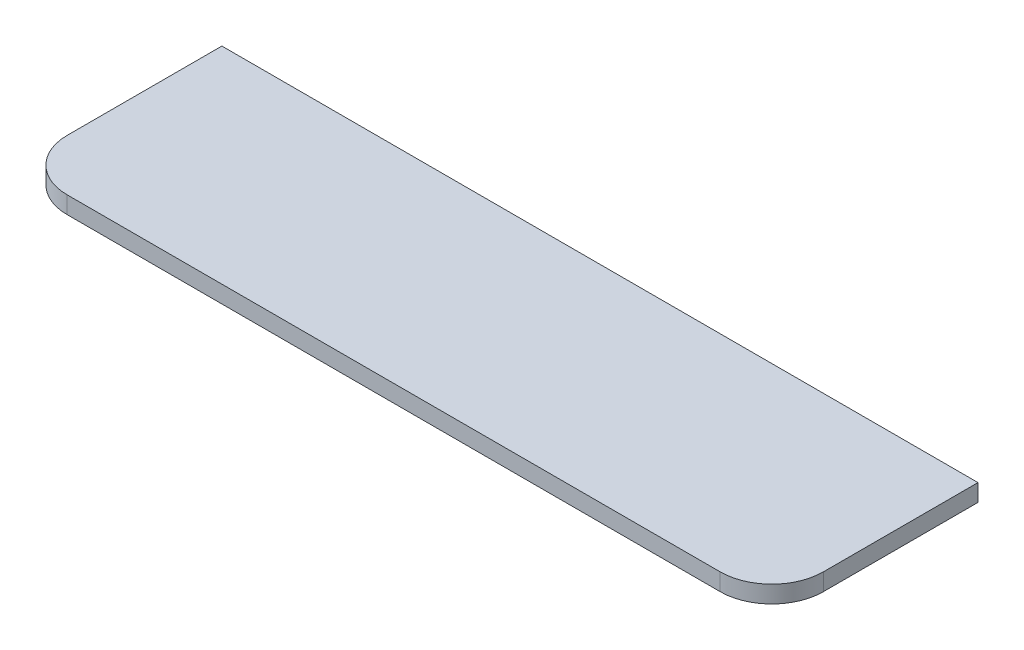
ISO-10303-21;
HEADER;
FILE_DESCRIPTION(('STEP AP214'),'2;1');
FILE_NAME('part.step','',(''),(''),'','','');
FILE_SCHEMA(('AUTOMOTIVE_DESIGN { 1 0 10303 214 1 1 1 1 }'));
ENDSEC;
DATA;
#1=APPLICATION_CONTEXT('core data for automotive mechanical design processes');
#2=APPLICATION_PROTOCOL_DEFINITION('international standard','automotive_design',2000,#1);
#3=PRODUCT_CONTEXT('',#1,'mechanical');
#4=PRODUCT('Part','Part','',(#3));
#5=PRODUCT_RELATED_PRODUCT_CATEGORY('part','',(#4));
#6=PRODUCT_DEFINITION_FORMATION('','',#4);
#7=PRODUCT_DEFINITION_CONTEXT('part definition',#1,'design');
#8=PRODUCT_DEFINITION('design','',#6,#7);
#9=PRODUCT_DEFINITION_SHAPE('','',#8);
#10=(LENGTH_UNIT() NAMED_UNIT(*) SI_UNIT(.MILLI.,.METRE.));
#11=(NAMED_UNIT(*) PLANE_ANGLE_UNIT() SI_UNIT($,.RADIAN.));
#12=(NAMED_UNIT(*) SI_UNIT($,.STERADIAN.) SOLID_ANGLE_UNIT());
#13=UNCERTAINTY_MEASURE_WITH_UNIT(LENGTH_MEASURE(1.E-05),#10,'distance_accuracy_value','');
#14=(GEOMETRIC_REPRESENTATION_CONTEXT(3) GLOBAL_UNCERTAINTY_ASSIGNED_CONTEXT((#13)) GLOBAL_UNIT_ASSIGNED_CONTEXT((#10,
#11,#12)) REPRESENTATION_CONTEXT('',''));
#15=CARTESIAN_POINT('',(0.,0.,0.));
#16=DIRECTION('',(0.,0.,1.));
#17=DIRECTION('',(1.,0.,0.));
#18=AXIS2_PLACEMENT_3D('',#15,#16,#17);
#19=CARTESIAN_POINT('',(220.,10.,30.));
#20=DIRECTION('',(-1.,0.,0.));
#21=DIRECTION('',(0.,0.,1.));
#22=AXIS2_PLACEMENT_3D('',#19,#20,#21);
#23=PLANE('',#22);
#24=DIRECTION('',(0.,0.,-1.));
#25=VECTOR('',#24,1.);
#26=CARTESIAN_POINT('',(220.,0.,30.));
#27=LINE('',#26,#25);
#28=CARTESIAN_POINT('',(220.,0.,30.));
#29=VERTEX_POINT('',#28);
#30=CARTESIAN_POINT('',(220.,0.,-60.));
#31=VERTEX_POINT('',#30);
#32=EDGE_CURVE('E128',#29,#31,#27,.T.);
#33=ORIENTED_EDGE('',*,*,#32,.T.);
#34=DIRECTION('',(0.,-1.,0.));
#35=VECTOR('',#34,1.);
#36=CARTESIAN_POINT('',(220.,10.,-60.));
#37=LINE('',#36,#35);
#38=CARTESIAN_POINT('',(220.,10.,-60.));
#39=VERTEX_POINT('',#38);
#40=EDGE_CURVE('E11',#39,#31,#37,.T.);
#41=ORIENTED_EDGE('',*,*,#40,.F.);
#42=DIRECTION('',(0.,0.,-1.));
#43=VECTOR('',#42,1.);
#44=CARTESIAN_POINT('',(220.,10.,30.));
#45=LINE('',#44,#43);
#46=CARTESIAN_POINT('',(220.,10.,30.));
#47=VERTEX_POINT('',#46);
#48=EDGE_CURVE('E144',#47,#39,#45,.T.);
#49=ORIENTED_EDGE('',*,*,#48,.F.);
#50=DIRECTION('',(0.,-1.,0.));
#51=VECTOR('',#50,1.);
#52=CARTESIAN_POINT('',(220.,10.,30.));
#53=LINE('',#52,#51);
#54=EDGE_CURVE('E124',#47,#29,#53,.T.);
#55=ORIENTED_EDGE('',*,*,#54,.T.);
#56=EDGE_LOOP('',(#33,#41,#49,#55));
#57=FACE_BOUND('',#56,.T.);
#58=ADVANCED_FACE('F39',(#57),#23,.F.);
#59=CARTESIAN_POINT('',(-220.,10.,-60.));
#60=DIRECTION('',(0.,0.,1.));
#61=DIRECTION('',(1.,0.,0.));
#62=AXIS2_PLACEMENT_3D('',#59,#60,#61);
#63=PLANE('',#62);
#64=DIRECTION('',(-1.,0.,0.));
#65=VECTOR('',#64,1.);
#66=CARTESIAN_POINT('',(-220.,0.,-60.));
#67=LINE('',#66,#65);
#68=CARTESIAN_POINT('',(-220.,0.,-60.));
#69=VERTEX_POINT('',#68);
#70=EDGE_CURVE('E132',#31,#69,#67,.T.);
#71=ORIENTED_EDGE('',*,*,#70,.T.);
#72=DIRECTION('',(0.,-1.,0.));
#73=VECTOR('',#72,1.);
#74=CARTESIAN_POINT('',(-220.,10.,-60.));
#75=LINE('',#74,#73);
#76=CARTESIAN_POINT('',(-220.,10.,-60.));
#77=VERTEX_POINT('',#76);
#78=EDGE_CURVE('E48',#77,#69,#75,.T.);
#79=ORIENTED_EDGE('',*,*,#78,.F.);
#80=DIRECTION('',(-1.,0.,0.));
#81=VECTOR('',#80,1.);
#82=CARTESIAN_POINT('',(-220.,10.,-60.));
#83=LINE('',#82,#81);
#84=EDGE_CURVE('E93',#39,#77,#83,.T.);
#85=ORIENTED_EDGE('',*,*,#84,.F.);
#86=ORIENTED_EDGE('',*,*,#40,.T.);
#87=EDGE_LOOP('',(#71,#79,#85,#86));
#88=FACE_BOUND('',#87,.T.);
#89=ADVANCED_FACE('F172',(#88),#63,.F.);
#90=CARTESIAN_POINT('',(-220.,10.,30.));
#91=DIRECTION('',(1.,0.,0.));
#92=DIRECTION('',(0.,0.,-1.));
#93=AXIS2_PLACEMENT_3D('',#90,#91,#92);
#94=PLANE('',#93);
#95=DIRECTION('',(0.,0.,1.));
#96=VECTOR('',#95,1.);
#97=CARTESIAN_POINT('',(-220.,0.,30.));
#98=LINE('',#97,#96);
#99=CARTESIAN_POINT('',(-220.,0.,30.));
#100=VERTEX_POINT('',#99);
#101=EDGE_CURVE('E135',#69,#100,#98,.T.);
#102=ORIENTED_EDGE('',*,*,#101,.T.);
#103=DIRECTION('',(0.,-1.,0.));
#104=VECTOR('',#103,1.);
#105=CARTESIAN_POINT('',(-220.,10.,30.));
#106=LINE('',#105,#104);
#107=CARTESIAN_POINT('',(-220.,10.,30.));
#108=VERTEX_POINT('',#107);
#109=EDGE_CURVE('E117',#108,#100,#106,.T.);
#110=ORIENTED_EDGE('',*,*,#109,.F.);
#111=DIRECTION('',(0.,0.,1.));
#112=VECTOR('',#111,1.);
#113=CARTESIAN_POINT('',(-220.,10.,30.));
#114=LINE('',#113,#112);
#115=EDGE_CURVE('E106',#77,#108,#114,.T.);
#116=ORIENTED_EDGE('',*,*,#115,.F.);
#117=ORIENTED_EDGE('',*,*,#78,.T.);
#118=EDGE_LOOP('',(#102,#110,#116,#117));
#119=FACE_BOUND('',#118,.T.);
#120=ADVANCED_FACE('F154',(#119),#94,.F.);
#121=CARTESIAN_POINT('',(-190.,10.,30.));
#122=DIRECTION('',(0.,-1.,0.));
#123=DIRECTION('',(0.,0.,-1.));
#124=AXIS2_PLACEMENT_3D('',#121,#122,#123);
#125=CYLINDRICAL_SURFACE('',#124,30.);
#126=CARTESIAN_POINT('',(-190.,0.,30.));
#127=DIRECTION('',(0.,1.,0.));
#128=DIRECTION('',(0.,0.,-1.));
#129=AXIS2_PLACEMENT_3D('',#126,#127,#128);
#130=CIRCLE('',#129,30.);
#131=CARTESIAN_POINT('',(-190.,0.,60.));
#132=VERTEX_POINT('',#131);
#133=EDGE_CURVE('E115',#100,#132,#130,.T.);
#134=ORIENTED_EDGE('',*,*,#133,.T.);
#135=DIRECTION('',(0.,-1.,0.));
#136=VECTOR('',#135,1.);
#137=CARTESIAN_POINT('',(-190.,10.,60.));
#138=LINE('',#137,#136);
#139=CARTESIAN_POINT('',(-190.,10.,60.));
#140=VERTEX_POINT('',#139);
#141=EDGE_CURVE('E112',#140,#132,#138,.T.);
#142=ORIENTED_EDGE('',*,*,#141,.F.);
#143=CARTESIAN_POINT('',(-190.,10.,30.));
#144=DIRECTION('',(0.,1.,0.));
#145=DIRECTION('',(0.,0.,-1.));
#146=AXIS2_PLACEMENT_3D('',#143,#144,#145);
#147=CIRCLE('',#146,30.);
#148=EDGE_CURVE('E100',#108,#140,#147,.T.);
#149=ORIENTED_EDGE('',*,*,#148,.F.);
#150=ORIENTED_EDGE('',*,*,#109,.T.);
#151=EDGE_LOOP('',(#134,#142,#149,#150));
#152=FACE_BOUND('',#151,.T.);
#153=ADVANCED_FACE('F113',(#152),#125,.T.);
#154=CARTESIAN_POINT('',(-190.,10.,60.));
#155=DIRECTION('',(0.,0.,-1.));
#156=DIRECTION('',(-1.,0.,0.));
#157=AXIS2_PLACEMENT_3D('',#154,#155,#156);
#158=PLANE('',#157);
#159=DIRECTION('',(1.,0.,0.));
#160=VECTOR('',#159,1.);
#161=CARTESIAN_POINT('',(-190.,0.,60.));
#162=LINE('',#161,#160);
#163=CARTESIAN_POINT('',(190.,0.,60.));
#164=VERTEX_POINT('',#163);
#165=EDGE_CURVE('E79',#132,#164,#162,.T.);
#166=ORIENTED_EDGE('',*,*,#165,.T.);
#167=DIRECTION('',(0.,-1.,0.));
#168=VECTOR('',#167,1.);
#169=CARTESIAN_POINT('',(190.,10.,60.));
#170=LINE('',#169,#168);
#171=CARTESIAN_POINT('',(190.,10.,60.));
#172=VERTEX_POINT('',#171);
#173=EDGE_CURVE('E118',#172,#164,#170,.T.);
#174=ORIENTED_EDGE('',*,*,#173,.F.);
#175=DIRECTION('',(1.,0.,0.));
#176=VECTOR('',#175,1.);
#177=CARTESIAN_POINT('',(-190.,10.,60.));
#178=LINE('',#177,#176);
#179=EDGE_CURVE('E104',#140,#172,#178,.T.);
#180=ORIENTED_EDGE('',*,*,#179,.F.);
#181=ORIENTED_EDGE('',*,*,#141,.T.);
#182=EDGE_LOOP('',(#166,#174,#180,#181));
#183=FACE_BOUND('',#182,.T.);
#184=ADVANCED_FACE('F120',(#183),#158,.F.);
#185=CARTESIAN_POINT('',(190.,10.,30.));
#186=DIRECTION('',(0.,-1.,0.));
#187=DIRECTION('',(0.,0.,-1.));
#188=AXIS2_PLACEMENT_3D('',#185,#186,#187);
#189=CYLINDRICAL_SURFACE('',#188,30.);
#190=CARTESIAN_POINT('',(190.,0.,30.));
#191=DIRECTION('',(0.,1.,0.));
#192=DIRECTION('',(0.,0.,1.));
#193=AXIS2_PLACEMENT_3D('',#190,#191,#192);
#194=CIRCLE('',#193,30.);
#195=EDGE_CURVE('E85',#164,#29,#194,.T.);
#196=ORIENTED_EDGE('',*,*,#195,.T.);
#197=ORIENTED_EDGE('',*,*,#54,.F.);
#198=CARTESIAN_POINT('',(190.,10.,30.));
#199=DIRECTION('',(0.,1.,0.));
#200=DIRECTION('',(0.,0.,1.));
#201=AXIS2_PLACEMENT_3D('',#198,#199,#200);
#202=CIRCLE('',#201,30.);
#203=EDGE_CURVE('E56',#172,#47,#202,.T.);
#204=ORIENTED_EDGE('',*,*,#203,.F.);
#205=ORIENTED_EDGE('',*,*,#173,.T.);
#206=EDGE_LOOP('',(#196,#197,#204,#205));
#207=FACE_BOUND('',#206,.T.);
#208=ADVANCED_FACE('F161',(#207),#189,.T.);
#209=CARTESIAN_POINT('',(-190.,10.,30.));
#210=DIRECTION('',(0.,-1.,0.));
#211=DIRECTION('',(0.,0.,-1.));
#212=AXIS2_PLACEMENT_3D('',#209,#210,#211);
#213=PLANE('',#212);
#214=ORIENTED_EDGE('',*,*,#48,.T.);
#215=ORIENTED_EDGE('',*,*,#84,.T.);
#216=ORIENTED_EDGE('',*,*,#115,.T.);
#217=ORIENTED_EDGE('',*,*,#148,.T.);
#218=ORIENTED_EDGE('',*,*,#179,.T.);
#219=ORIENTED_EDGE('',*,*,#203,.T.);
#220=EDGE_LOOP('',(#214,#215,#216,#217,#218,#219));
#221=FACE_BOUND('',#220,.T.);
#222=ADVANCED_FACE('F102',(#221),#213,.F.);
#223=CARTESIAN_POINT('',(-190.,0.,30.));
#224=DIRECTION('',(0.,-1.,0.));
#225=DIRECTION('',(0.,0.,-1.));
#226=AXIS2_PLACEMENT_3D('',#223,#224,#225);
#227=PLANE('',#226);
#228=ORIENTED_EDGE('',*,*,#32,.F.);
#229=ORIENTED_EDGE('',*,*,#195,.F.);
#230=ORIENTED_EDGE('',*,*,#165,.F.);
#231=ORIENTED_EDGE('',*,*,#133,.F.);
#232=ORIENTED_EDGE('',*,*,#101,.F.);
#233=ORIENTED_EDGE('',*,*,#70,.F.);
#234=EDGE_LOOP('',(#228,#229,#230,#231,#232,#233));
#235=FACE_BOUND('',#234,.T.);
#236=ADVANCED_FACE('F157',(#235),#227,.T.);
#237=CLOSED_SHELL('',(#58,#89,#120,#153,#184,#208,#222,#236));
#238=MANIFOLD_SOLID_BREP('B2',#237);
#239=ADVANCED_BREP_SHAPE_REPRESENTATION('',(#18,#238),#14);
#240=SHAPE_DEFINITION_REPRESENTATION(#9,#239);
ENDSEC;
END-ISO-10303-21;
